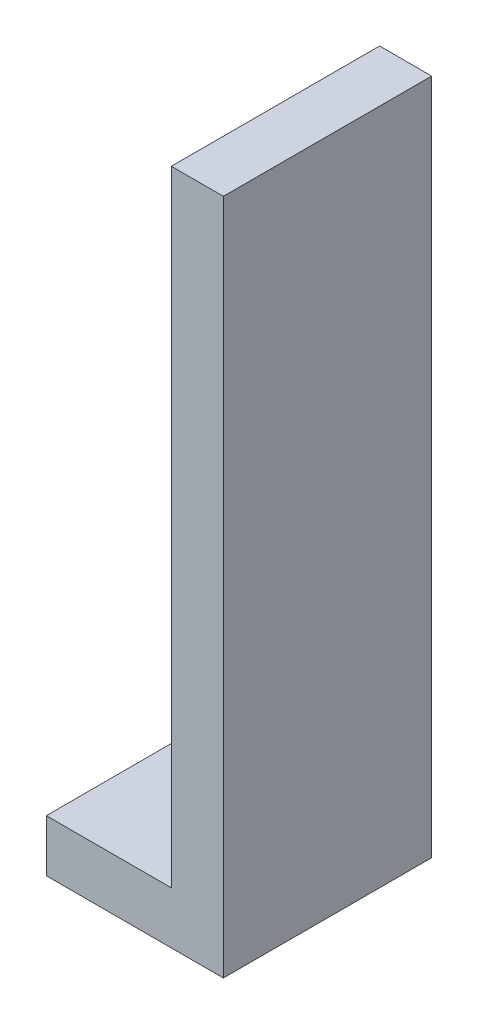
ISO-10303-21;
HEADER;
FILE_DESCRIPTION(('STEP AP214'),'2;1');
FILE_NAME('part.step','',(''),(''),'','','');
FILE_SCHEMA(('AUTOMOTIVE_DESIGN { 1 0 10303 214 1 1 1 1 }'));
ENDSEC;
DATA;
#1=APPLICATION_CONTEXT('core data for automotive mechanical design processes');
#2=APPLICATION_PROTOCOL_DEFINITION('international standard','automotive_design',2000,#1);
#3=PRODUCT_CONTEXT('',#1,'mechanical');
#4=PRODUCT('Part','Part','',(#3));
#5=PRODUCT_RELATED_PRODUCT_CATEGORY('part','',(#4));
#6=PRODUCT_DEFINITION_FORMATION('','',#4);
#7=PRODUCT_DEFINITION_CONTEXT('part definition',#1,'design');
#8=PRODUCT_DEFINITION('design','',#6,#7);
#9=PRODUCT_DEFINITION_SHAPE('','',#8);
#10=(LENGTH_UNIT() NAMED_UNIT(*) SI_UNIT(.MILLI.,.METRE.));
#11=(NAMED_UNIT(*) PLANE_ANGLE_UNIT() SI_UNIT($,.RADIAN.));
#12=(NAMED_UNIT(*) SI_UNIT($,.STERADIAN.) SOLID_ANGLE_UNIT());
#13=UNCERTAINTY_MEASURE_WITH_UNIT(LENGTH_MEASURE(1.E-05),#10,'distance_accuracy_value','');
#14=(GEOMETRIC_REPRESENTATION_CONTEXT(3) GLOBAL_UNCERTAINTY_ASSIGNED_CONTEXT((#13)) GLOBAL_UNIT_ASSIGNED_CONTEXT((#10,
#11,#12)) REPRESENTATION_CONTEXT('',''));
#15=CARTESIAN_POINT('',(0.,0.,0.));
#16=DIRECTION('',(0.,0.,1.));
#17=DIRECTION('',(1.,0.,0.));
#18=AXIS2_PLACEMENT_3D('',#15,#16,#17);
#19=CARTESIAN_POINT('',(0.,60.,20.));
#20=DIRECTION('',(0.,-1.,0.));
#21=DIRECTION('',(0.,0.,-1.));
#22=AXIS2_PLACEMENT_3D('',#19,#20,#21);
#23=PLANE('',#22);
#24=DIRECTION('',(-1.,0.,0.));
#25=VECTOR('',#24,1.);
#26=CARTESIAN_POINT('',(0.,60.,20.));
#27=LINE('',#26,#25);
#28=CARTESIAN_POINT('',(-5.,60.,20.));
#29=VERTEX_POINT('',#28);
#30=CARTESIAN_POINT('',(-10.,60.,20.));
#31=VERTEX_POINT('',#30);
#32=EDGE_CURVE('E55',#29,#31,#27,.T.);
#33=ORIENTED_EDGE('',*,*,#32,.F.);
#34=DIRECTION('',(0.,0.,-1.));
#35=VECTOR('',#34,1.);
#36=CARTESIAN_POINT('',(-5.,60.,20.));
#37=LINE('',#36,#35);
#38=CARTESIAN_POINT('',(-5.,60.,0.));
#39=VERTEX_POINT('',#38);
#40=EDGE_CURVE('E94',#29,#39,#37,.T.);
#41=ORIENTED_EDGE('',*,*,#40,.T.);
#42=DIRECTION('',(-1.,0.,0.));
#43=VECTOR('',#42,1.);
#44=CARTESIAN_POINT('',(0.,60.,0.));
#45=LINE('',#44,#43);
#46=CARTESIAN_POINT('',(-10.,60.,0.));
#47=VERTEX_POINT('',#46);
#48=EDGE_CURVE('E77',#39,#47,#45,.T.);
#49=ORIENTED_EDGE('',*,*,#48,.T.);
#50=DIRECTION('',(0.,0.,-1.));
#51=VECTOR('',#50,1.);
#52=CARTESIAN_POINT('',(-10.,60.,20.));
#53=LINE('',#52,#51);
#54=EDGE_CURVE('E121',#31,#47,#53,.T.);
#55=ORIENTED_EDGE('',*,*,#54,.F.);
#56=EDGE_LOOP('',(#33,#41,#49,#55));
#57=FACE_BOUND('',#56,.T.);
#58=ADVANCED_FACE('F33',(#57),#23,.F.);
#59=CARTESIAN_POINT('',(-5.,-5.,20.));
#60=DIRECTION('',(0.,1.,0.));
#61=DIRECTION('',(0.,0.,1.));
#62=AXIS2_PLACEMENT_3D('',#59,#60,#61);
#63=PLANE('',#62);
#64=CARTESIAN_POINT('',(-16.,-5.,10.));
#65=DIRECTION('',(0.,1.,0.));
#66=DIRECTION('',(0.,0.,1.));
#67=AXIS2_PLACEMENT_3D('',#64,#65,#66);
#68=CIRCLE('',#67,1.7);
#69=CARTESIAN_POINT('',(-16.,-5.,11.7));
#70=VERTEX_POINT('',#69);
#71=EDGE_CURVE('E133',#70,#70,#68,.F.);
#72=ORIENTED_EDGE('',*,*,#71,.F.);
#73=EDGE_LOOP('',(#72));
#74=FACE_BOUND('',#73,.T.);
#75=DIRECTION('',(1.,0.,0.));
#76=VECTOR('',#75,1.);
#77=CARTESIAN_POINT('',(-5.,-5.,0.));
#78=LINE('',#77,#76);
#79=CARTESIAN_POINT('',(-22.,-5.,0.));
#80=VERTEX_POINT('',#79);
#81=CARTESIAN_POINT('',(-5.,-5.,0.));
#82=VERTEX_POINT('',#81);
#83=EDGE_CURVE('E102',#80,#82,#78,.T.);
#84=ORIENTED_EDGE('',*,*,#83,.T.);
#85=DIRECTION('',(0.,0.,-1.));
#86=VECTOR('',#85,1.);
#87=CARTESIAN_POINT('',(-5.,-5.,20.));
#88=LINE('',#87,#86);
#89=CARTESIAN_POINT('',(-5.,-5.,20.));
#90=VERTEX_POINT('',#89);
#91=EDGE_CURVE('E47',#90,#82,#88,.T.);
#92=ORIENTED_EDGE('',*,*,#91,.F.);
#93=DIRECTION('',(1.,0.,0.));
#94=VECTOR('',#93,1.);
#95=CARTESIAN_POINT('',(-5.,-5.,20.));
#96=LINE('',#95,#94);
#97=CARTESIAN_POINT('',(-22.,-5.,20.));
#98=VERTEX_POINT('',#97);
#99=EDGE_CURVE('E40',#98,#90,#96,.T.);
#100=ORIENTED_EDGE('',*,*,#99,.F.);
#101=DIRECTION('',(0.,0.,-1.));
#102=VECTOR('',#101,1.);
#103=CARTESIAN_POINT('',(-22.,-5.,20.));
#104=LINE('',#103,#102);
#105=EDGE_CURVE('E117',#98,#80,#104,.T.);
#106=ORIENTED_EDGE('',*,*,#105,.T.);
#107=EDGE_LOOP('',(#84,#92,#100,#106));
#108=FACE_BOUND('',#107,.T.);
#109=ADVANCED_FACE('F99',(#74,#108),#63,.F.);
#110=CARTESIAN_POINT('',(0.,0.,20.));
#111=DIRECTION('',(0.,0.,1.));
#112=DIRECTION('',(1.,0.,0.));
#113=AXIS2_PLACEMENT_3D('',#110,#111,#112);
#114=PLANE('',#113);
#115=DIRECTION('',(0.,-1.,0.));
#116=VECTOR('',#115,1.);
#117=CARTESIAN_POINT('',(-5.,77.,20.));
#118=LINE('',#117,#116);
#119=EDGE_CURVE('E92',#29,#90,#118,.T.);
#120=ORIENTED_EDGE('',*,*,#119,.F.);
#121=ORIENTED_EDGE('',*,*,#32,.T.);
#122=DIRECTION('',(0.,1.,0.));
#123=VECTOR('',#122,1.);
#124=CARTESIAN_POINT('',(-10.,0.,20.));
#125=LINE('',#124,#123);
#126=CARTESIAN_POINT('',(-10.,0.,20.));
#127=VERTEX_POINT('',#126);
#128=EDGE_CURVE('E126',#127,#31,#125,.T.);
#129=ORIENTED_EDGE('',*,*,#128,.F.);
#130=DIRECTION('',(1.,0.,0.));
#131=VECTOR('',#130,1.);
#132=CARTESIAN_POINT('',(-10.,0.,20.));
#133=LINE('',#132,#131);
#134=CARTESIAN_POINT('',(-22.,0.,20.));
#135=VERTEX_POINT('',#134);
#136=EDGE_CURVE('E135',#135,#127,#133,.T.);
#137=ORIENTED_EDGE('',*,*,#136,.F.);
#138=DIRECTION('',(0.,1.,0.));
#139=VECTOR('',#138,1.);
#140=CARTESIAN_POINT('',(-22.,-5.,20.));
#141=LINE('',#140,#139);
#142=EDGE_CURVE('E108',#98,#135,#141,.T.);
#143=ORIENTED_EDGE('',*,*,#142,.F.);
#144=ORIENTED_EDGE('',*,*,#99,.T.);
#145=EDGE_LOOP('',(#120,#121,#129,#137,#143,#144));
#146=FACE_BOUND('',#145,.T.);
#147=ADVANCED_FACE('F105',(#146),#114,.T.);
#148=CARTESIAN_POINT('',(0.,0.,0.));
#149=DIRECTION('',(0.,0.,1.));
#150=DIRECTION('',(1.,0.,0.));
#151=AXIS2_PLACEMENT_3D('',#148,#149,#150);
#152=PLANE('',#151);
#153=ORIENTED_EDGE('',*,*,#48,.F.);
#154=DIRECTION('',(0.,-1.,0.));
#155=VECTOR('',#154,1.);
#156=CARTESIAN_POINT('',(-5.,0.,0.));
#157=LINE('',#156,#155);
#158=EDGE_CURVE('E11',#39,#82,#157,.T.);
#159=ORIENTED_EDGE('',*,*,#158,.T.);
#160=ORIENTED_EDGE('',*,*,#83,.F.);
#161=DIRECTION('',(0.,1.,0.));
#162=VECTOR('',#161,1.);
#163=CARTESIAN_POINT('',(-22.,-5.,0.));
#164=LINE('',#163,#162);
#165=CARTESIAN_POINT('',(-22.,0.,0.));
#166=VERTEX_POINT('',#165);
#167=EDGE_CURVE('E123',#80,#166,#164,.T.);
#168=ORIENTED_EDGE('',*,*,#167,.T.);
#169=DIRECTION('',(1.,0.,0.));
#170=VECTOR('',#169,1.);
#171=CARTESIAN_POINT('',(-10.,0.,0.));
#172=LINE('',#171,#170);
#173=CARTESIAN_POINT('',(-10.,0.,0.));
#174=VERTEX_POINT('',#173);
#175=EDGE_CURVE('E127',#166,#174,#172,.T.);
#176=ORIENTED_EDGE('',*,*,#175,.T.);
#177=DIRECTION('',(0.,1.,0.));
#178=VECTOR('',#177,1.);
#179=CARTESIAN_POINT('',(-10.,0.,0.));
#180=LINE('',#179,#178);
#181=EDGE_CURVE('E130',#174,#47,#180,.T.);
#182=ORIENTED_EDGE('',*,*,#181,.T.);
#183=EDGE_LOOP('',(#153,#159,#160,#168,#176,#182));
#184=FACE_BOUND('',#183,.T.);
#185=ADVANCED_FACE('F144',(#184),#152,.F.);
#186=CARTESIAN_POINT('',(-10.,0.,20.));
#187=DIRECTION('',(-1.,0.,0.));
#188=DIRECTION('',(0.,0.,1.));
#189=AXIS2_PLACEMENT_3D('',#186,#187,#188);
#190=PLANE('',#189);
#191=ORIENTED_EDGE('',*,*,#181,.F.);
#192=DIRECTION('',(0.,0.,-1.));
#193=VECTOR('',#192,1.);
#194=CARTESIAN_POINT('',(-10.,0.,20.));
#195=LINE('',#194,#193);
#196=EDGE_CURVE('E84',#127,#174,#195,.T.);
#197=ORIENTED_EDGE('',*,*,#196,.F.);
#198=ORIENTED_EDGE('',*,*,#128,.T.);
#199=ORIENTED_EDGE('',*,*,#54,.T.);
#200=EDGE_LOOP('',(#191,#197,#198,#199));
#201=FACE_BOUND('',#200,.T.);
#202=ADVANCED_FACE('F145',(#201),#190,.T.);
#203=CARTESIAN_POINT('',(-10.,0.,20.));
#204=DIRECTION('',(0.,1.,0.));
#205=DIRECTION('',(0.,0.,1.));
#206=AXIS2_PLACEMENT_3D('',#203,#204,#205);
#207=PLANE('',#206);
#208=CARTESIAN_POINT('',(-16.,0.,10.));
#209=DIRECTION('',(0.,-1.,0.));
#210=DIRECTION('',(0.,0.,1.));
#211=AXIS2_PLACEMENT_3D('',#208,#209,#210);
#212=CIRCLE('',#211,1.7);
#213=CARTESIAN_POINT('',(-16.,0.,11.7));
#214=VERTEX_POINT('',#213);
#215=EDGE_CURVE('E140',#214,#214,#212,.T.);
#216=ORIENTED_EDGE('',*,*,#215,.T.);
#217=EDGE_LOOP('',(#216));
#218=FACE_BOUND('',#217,.T.);
#219=ORIENTED_EDGE('',*,*,#175,.F.);
#220=DIRECTION('',(0.,0.,-1.));
#221=VECTOR('',#220,1.);
#222=CARTESIAN_POINT('',(-22.,0.,20.));
#223=LINE('',#222,#221);
#224=EDGE_CURVE('E113',#135,#166,#223,.T.);
#225=ORIENTED_EDGE('',*,*,#224,.F.);
#226=ORIENTED_EDGE('',*,*,#136,.T.);
#227=ORIENTED_EDGE('',*,*,#196,.T.);
#228=EDGE_LOOP('',(#219,#225,#226,#227));
#229=FACE_BOUND('',#228,.T.);
#230=ADVANCED_FACE('F146',(#218,#229),#207,.T.);
#231=CARTESIAN_POINT('',(-22.,-5.,20.));
#232=DIRECTION('',(-1.,0.,0.));
#233=DIRECTION('',(0.,0.,1.));
#234=AXIS2_PLACEMENT_3D('',#231,#232,#233);
#235=PLANE('',#234);
#236=ORIENTED_EDGE('',*,*,#167,.F.);
#237=ORIENTED_EDGE('',*,*,#105,.F.);
#238=ORIENTED_EDGE('',*,*,#142,.T.);
#239=ORIENTED_EDGE('',*,*,#224,.T.);
#240=EDGE_LOOP('',(#236,#237,#238,#239));
#241=FACE_BOUND('',#240,.T.);
#242=ADVANCED_FACE('F149',(#241),#235,.T.);
#243=CARTESIAN_POINT('',(-16.,-20.,10.));
#244=DIRECTION('',(0.,1.,0.));
#245=DIRECTION('',(0.,0.,1.));
#246=AXIS2_PLACEMENT_3D('',#243,#244,#245);
#247=CYLINDRICAL_SURFACE('',#246,1.7);
#248=ORIENTED_EDGE('',*,*,#215,.F.);
#249=EDGE_LOOP('',(#248));
#250=FACE_BOUND('',#249,.T.);
#251=ORIENTED_EDGE('',*,*,#71,.T.);
#252=EDGE_LOOP('',(#251));
#253=FACE_BOUND('',#252,.T.);
#254=ADVANCED_FACE('F151',(#250,#253),#247,.F.);
#255=CARTESIAN_POINT('',(-5.,77.,20.));
#256=DIRECTION('',(-1.,0.,0.));
#257=DIRECTION('',(0.,0.,1.));
#258=AXIS2_PLACEMENT_3D('',#255,#256,#257);
#259=PLANE('',#258);
#260=ORIENTED_EDGE('',*,*,#119,.T.);
#261=ORIENTED_EDGE('',*,*,#91,.T.);
#262=ORIENTED_EDGE('',*,*,#158,.F.);
#263=ORIENTED_EDGE('',*,*,#40,.F.);
#264=EDGE_LOOP('',(#260,#261,#262,#263));
#265=FACE_BOUND('',#264,.T.);
#266=ADVANCED_FACE('F93',(#265),#259,.F.);
#267=CLOSED_SHELL('',(#58,#109,#147,#185,#202,#230,#242,#254,#266));
#268=MANIFOLD_SOLID_BREP('B2',#267);
#269=ADVANCED_BREP_SHAPE_REPRESENTATION('',(#18,#268),#14);
#270=SHAPE_DEFINITION_REPRESENTATION(#9,#269);
ENDSEC;
END-ISO-10303-21;
